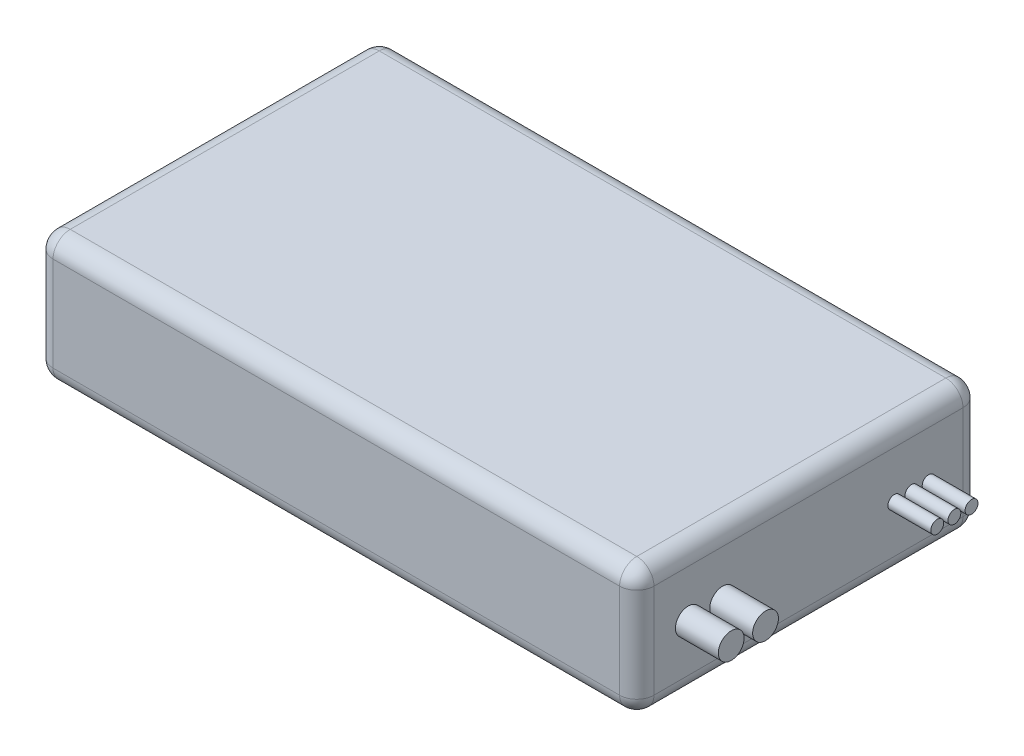
ISO-10303-21;
HEADER;
FILE_DESCRIPTION(('STEP AP214'),'2;1');
FILE_NAME('part.step','',(''),(''),'','','');
FILE_SCHEMA(('AUTOMOTIVE_DESIGN { 1 0 10303 214 1 1 1 1 }'));
ENDSEC;
DATA;
#1=APPLICATION_CONTEXT('core data for automotive mechanical design processes');
#2=APPLICATION_PROTOCOL_DEFINITION('international standard','automotive_design',2000,#1);
#3=PRODUCT_CONTEXT('',#1,'mechanical');
#4=PRODUCT('Part','Part','',(#3));
#5=PRODUCT_RELATED_PRODUCT_CATEGORY('part','',(#4));
#6=PRODUCT_DEFINITION_FORMATION('','',#4);
#7=PRODUCT_DEFINITION_CONTEXT('part definition',#1,'design');
#8=PRODUCT_DEFINITION('design','',#6,#7);
#9=PRODUCT_DEFINITION_SHAPE('','',#8);
#10=(LENGTH_UNIT() NAMED_UNIT(*) SI_UNIT(.MILLI.,.METRE.));
#11=(NAMED_UNIT(*) PLANE_ANGLE_UNIT() SI_UNIT($,.RADIAN.));
#12=(NAMED_UNIT(*) SI_UNIT($,.STERADIAN.) SOLID_ANGLE_UNIT());
#13=UNCERTAINTY_MEASURE_WITH_UNIT(LENGTH_MEASURE(1.E-05),#10,'distance_accuracy_value','');
#14=(GEOMETRIC_REPRESENTATION_CONTEXT(3) GLOBAL_UNCERTAINTY_ASSIGNED_CONTEXT((#13)) GLOBAL_UNIT_ASSIGNED_CONTEXT((#10,
#11,#12)) REPRESENTATION_CONTEXT('',''));
#15=CARTESIAN_POINT('',(0.,0.,0.));
#16=DIRECTION('',(0.,0.,1.));
#17=DIRECTION('',(1.,0.,0.));
#18=AXIS2_PLACEMENT_3D('',#15,#16,#17);
#19=CARTESIAN_POINT('',(70.,15.,0.));
#20=DIRECTION('',(-1.,0.,0.));
#21=DIRECTION('',(0.,0.,1.));
#22=AXIS2_PLACEMENT_3D('',#19,#20,#21);
#23=PLANE('',#22);
#24=CARTESIAN_POINT('',(70.,7.5,-32.));
#25=DIRECTION('',(-1.,0.,0.));
#26=DIRECTION('',(0.,0.,1.));
#27=AXIS2_PLACEMENT_3D('',#24,#25,#26);
#28=CIRCLE('',#27,0.749999999999999);
#29=CARTESIAN_POINT('',(70.,7.5,-31.25));
#30=VERTEX_POINT('',#29);
#31=EDGE_CURVE('E42',#30,#30,#28,.F.);
#32=ORIENTED_EDGE('',*,*,#31,.F.);
#33=EDGE_LOOP('',(#32));
#34=FACE_BOUND('',#33,.T.);
#35=CARTESIAN_POINT('',(70.,7.5,-10.));
#36=DIRECTION('',(-1.,0.,0.));
#37=DIRECTION('',(0.,0.,1.));
#38=AXIS2_PLACEMENT_3D('',#35,#36,#37);
#39=CIRCLE('',#38,1.5);
#40=CARTESIAN_POINT('',(70.,7.5,-8.5));
#41=VERTEX_POINT('',#40);
#42=EDGE_CURVE('E205',#41,#41,#39,.F.);
#43=ORIENTED_EDGE('',*,*,#42,.F.);
#44=EDGE_LOOP('',(#43));
#45=FACE_BOUND('',#44,.T.);
#46=DIRECTION('',(0.,-1.,0.));
#47=VECTOR('',#46,1.);
#48=CARTESIAN_POINT('',(70.,15.,-2.));
#49=LINE('',#48,#47);
#50=CARTESIAN_POINT('',(70.,13.,-2.));
#51=VERTEX_POINT('',#50);
#52=CARTESIAN_POINT('',(70.,2.,-2.));
#53=VERTEX_POINT('',#52);
#54=EDGE_CURVE('E224',#51,#53,#49,.T.);
#55=ORIENTED_EDGE('',*,*,#54,.T.);
#56=DIRECTION('',(0.,0.,-1.));
#57=VECTOR('',#56,1.);
#58=CARTESIAN_POINT('',(70.,2.,-40.));
#59=LINE('',#58,#57);
#60=CARTESIAN_POINT('',(70.,2.,-38.));
#61=VERTEX_POINT('',#60);
#62=EDGE_CURVE('E430',#53,#61,#59,.T.);
#63=ORIENTED_EDGE('',*,*,#62,.T.);
#64=DIRECTION('',(0.,-1.,0.));
#65=VECTOR('',#64,1.);
#66=CARTESIAN_POINT('',(70.,15.,-38.));
#67=LINE('',#66,#65);
#68=CARTESIAN_POINT('',(70.,13.,-38.));
#69=VERTEX_POINT('',#68);
#70=EDGE_CURVE('E427',#61,#69,#67,.F.);
#71=ORIENTED_EDGE('',*,*,#70,.T.);
#72=DIRECTION('',(0.,0.,-1.));
#73=VECTOR('',#72,1.);
#74=CARTESIAN_POINT('',(70.,13.,0.));
#75=LINE('',#74,#73);
#76=EDGE_CURVE('E369',#69,#51,#75,.F.);
#77=ORIENTED_EDGE('',*,*,#76,.T.);
#78=EDGE_LOOP('',(#55,#63,#71,#77));
#79=FACE_BOUND('',#78,.T.);
#80=CARTESIAN_POINT('',(70.,7.5,-6.));
#81=DIRECTION('',(-1.,0.,0.));
#82=DIRECTION('',(0.,0.,1.));
#83=AXIS2_PLACEMENT_3D('',#80,#81,#82);
#84=CIRCLE('',#83,1.5);
#85=CARTESIAN_POINT('',(70.,7.5,-4.5));
#86=VERTEX_POINT('',#85);
#87=EDGE_CURVE('E202',#86,#86,#84,.F.);
#88=ORIENTED_EDGE('',*,*,#87,.F.);
#89=EDGE_LOOP('',(#88));
#90=FACE_BOUND('',#89,.T.);
#91=CARTESIAN_POINT('',(70.,7.5,-30.));
#92=DIRECTION('',(-1.,0.,0.));
#93=DIRECTION('',(0.,0.,1.));
#94=AXIS2_PLACEMENT_3D('',#91,#92,#93);
#95=CIRCLE('',#94,0.750000000000002);
#96=CARTESIAN_POINT('',(70.,7.5,-29.25));
#97=VERTEX_POINT('',#96);
#98=EDGE_CURVE('E209',#97,#97,#95,.F.);
#99=ORIENTED_EDGE('',*,*,#98,.F.);
#100=EDGE_LOOP('',(#99));
#101=FACE_BOUND('',#100,.T.);
#102=CARTESIAN_POINT('',(70.,7.5,-34.));
#103=DIRECTION('',(-1.,0.,0.));
#104=DIRECTION('',(0.,0.,1.));
#105=AXIS2_PLACEMENT_3D('',#102,#103,#104);
#106=CIRCLE('',#105,0.749999999999999);
#107=CARTESIAN_POINT('',(70.,7.5,-33.25));
#108=VERTEX_POINT('',#107);
#109=EDGE_CURVE('E11',#108,#108,#106,.F.);
#110=ORIENTED_EDGE('',*,*,#109,.F.);
#111=EDGE_LOOP('',(#110));
#112=FACE_BOUND('',#111,.T.);
#113=ADVANCED_FACE('F34',(#34,#45,#79,#90,#101,#112),#23,.F.);
#114=CARTESIAN_POINT('',(0.,15.,0.));
#115=DIRECTION('',(1.,0.,0.));
#116=DIRECTION('',(0.,0.,-1.));
#117=AXIS2_PLACEMENT_3D('',#114,#115,#116);
#118=PLANE('',#117);
#119=DIRECTION('',(0.,-1.,0.));
#120=VECTOR('',#119,1.);
#121=CARTESIAN_POINT('',(0.,15.,-38.));
#122=LINE('',#121,#120);
#123=CARTESIAN_POINT('',(0.,13.,-38.));
#124=VERTEX_POINT('',#123);
#125=CARTESIAN_POINT('',(0.,2.,-38.));
#126=VERTEX_POINT('',#125);
#127=EDGE_CURVE('E133',#124,#126,#122,.T.);
#128=ORIENTED_EDGE('',*,*,#127,.T.);
#129=DIRECTION('',(0.,0.,1.));
#130=VECTOR('',#129,1.);
#131=CARTESIAN_POINT('',(0.,2.,0.));
#132=LINE('',#131,#130);
#133=CARTESIAN_POINT('',(0.,2.,-2.));
#134=VERTEX_POINT('',#133);
#135=EDGE_CURVE('E129',#126,#134,#132,.T.);
#136=ORIENTED_EDGE('',*,*,#135,.T.);
#137=DIRECTION('',(0.,-1.,0.));
#138=VECTOR('',#137,1.);
#139=CARTESIAN_POINT('',(0.,15.,-2.));
#140=LINE('',#139,#138);
#141=CARTESIAN_POINT('',(0.,13.,-2.));
#142=VERTEX_POINT('',#141);
#143=EDGE_CURVE('E123',#134,#142,#140,.F.);
#144=ORIENTED_EDGE('',*,*,#143,.T.);
#145=DIRECTION('',(0.,0.,1.));
#146=VECTOR('',#145,1.);
#147=CARTESIAN_POINT('',(0.,13.,0.));
#148=LINE('',#147,#146);
#149=EDGE_CURVE('E126',#142,#124,#148,.F.);
#150=ORIENTED_EDGE('',*,*,#149,.T.);
#151=EDGE_LOOP('',(#128,#136,#144,#150));
#152=FACE_BOUND('',#151,.T.);
#153=ADVANCED_FACE('F125',(#152),#118,.F.);
#154=CARTESIAN_POINT('',(0.,15.,0.));
#155=DIRECTION('',(0.,0.,-1.));
#156=DIRECTION('',(-1.,0.,0.));
#157=AXIS2_PLACEMENT_3D('',#154,#155,#156);
#158=PLANE('',#157);
#159=DIRECTION('',(0.,-1.,0.));
#160=VECTOR('',#159,1.);
#161=CARTESIAN_POINT('',(2.,15.,0.));
#162=LINE('',#161,#160);
#163=CARTESIAN_POINT('',(2.,13.,0.));
#164=VERTEX_POINT('',#163);
#165=CARTESIAN_POINT('',(2.,2.,0.));
#166=VERTEX_POINT('',#165);
#167=EDGE_CURVE('E156',#164,#166,#162,.T.);
#168=ORIENTED_EDGE('',*,*,#167,.T.);
#169=DIRECTION('',(1.,0.,0.));
#170=VECTOR('',#169,1.);
#171=CARTESIAN_POINT('',(70.,2.,0.));
#172=LINE('',#171,#170);
#173=CARTESIAN_POINT('',(68.,2.,0.));
#174=VERTEX_POINT('',#173);
#175=EDGE_CURVE('E424',#166,#174,#172,.T.);
#176=ORIENTED_EDGE('',*,*,#175,.T.);
#177=DIRECTION('',(0.,-1.,0.));
#178=VECTOR('',#177,1.);
#179=CARTESIAN_POINT('',(68.,15.,0.));
#180=LINE('',#179,#178);
#181=CARTESIAN_POINT('',(68.,13.,0.));
#182=VERTEX_POINT('',#181);
#183=EDGE_CURVE('E421',#174,#182,#180,.F.);
#184=ORIENTED_EDGE('',*,*,#183,.T.);
#185=DIRECTION('',(1.,0.,0.));
#186=VECTOR('',#185,1.);
#187=CARTESIAN_POINT('',(0.,13.,0.));
#188=LINE('',#187,#186);
#189=EDGE_CURVE('E419',#182,#164,#188,.F.);
#190=ORIENTED_EDGE('',*,*,#189,.T.);
#191=EDGE_LOOP('',(#168,#176,#184,#190));
#192=FACE_BOUND('',#191,.T.);
#193=ADVANCED_FACE('F284',(#192),#158,.F.);
#194=CARTESIAN_POINT('',(0.,15.,-40.));
#195=DIRECTION('',(0.,0.,1.));
#196=DIRECTION('',(1.,0.,0.));
#197=AXIS2_PLACEMENT_3D('',#194,#195,#196);
#198=PLANE('',#197);
#199=DIRECTION('',(0.,-1.,0.));
#200=VECTOR('',#199,1.);
#201=CARTESIAN_POINT('',(68.,15.,-40.));
#202=LINE('',#201,#200);
#203=CARTESIAN_POINT('',(68.,13.,-40.));
#204=VERTEX_POINT('',#203);
#205=CARTESIAN_POINT('',(68.,2.,-40.));
#206=VERTEX_POINT('',#205);
#207=EDGE_CURVE('E409',#204,#206,#202,.T.);
#208=ORIENTED_EDGE('',*,*,#207,.T.);
#209=DIRECTION('',(-1.,0.,0.));
#210=VECTOR('',#209,1.);
#211=CARTESIAN_POINT('',(0.,2.,-40.));
#212=LINE('',#211,#210);
#213=CARTESIAN_POINT('',(1.99999999999999,2.,-40.));
#214=VERTEX_POINT('',#213);
#215=EDGE_CURVE('E416',#206,#214,#212,.T.);
#216=ORIENTED_EDGE('',*,*,#215,.T.);
#217=DIRECTION('',(0.,-1.,0.));
#218=VECTOR('',#217,1.);
#219=CARTESIAN_POINT('',(1.99999999999999,15.,-40.));
#220=LINE('',#219,#218);
#221=CARTESIAN_POINT('',(1.99999999999999,13.,-40.));
#222=VERTEX_POINT('',#221);
#223=EDGE_CURVE('E414',#214,#222,#220,.F.);
#224=ORIENTED_EDGE('',*,*,#223,.T.);
#225=DIRECTION('',(-1.,0.,0.));
#226=VECTOR('',#225,1.);
#227=CARTESIAN_POINT('',(0.,13.,-40.));
#228=LINE('',#227,#226);
#229=EDGE_CURVE('E407',#222,#204,#228,.F.);
#230=ORIENTED_EDGE('',*,*,#229,.T.);
#231=EDGE_LOOP('',(#208,#216,#224,#230));
#232=FACE_BOUND('',#231,.T.);
#233=ADVANCED_FACE('F279',(#232),#198,.F.);
#234=CARTESIAN_POINT('',(0.,15.,-40.));
#235=DIRECTION('',(0.,-1.,0.));
#236=DIRECTION('',(0.,0.,-1.));
#237=AXIS2_PLACEMENT_3D('',#234,#235,#236);
#238=PLANE('',#237);
#239=DIRECTION('',(1.,0.,0.));
#240=VECTOR('',#239,1.);
#241=CARTESIAN_POINT('',(0.,15.,-2.));
#242=LINE('',#241,#240);
#243=CARTESIAN_POINT('',(2.,15.,-2.));
#244=VERTEX_POINT('',#243);
#245=CARTESIAN_POINT('',(68.,15.,-2.));
#246=VERTEX_POINT('',#245);
#247=EDGE_CURVE('E371',#244,#246,#242,.T.);
#248=ORIENTED_EDGE('',*,*,#247,.T.);
#249=DIRECTION('',(0.,0.,-1.));
#250=VECTOR('',#249,1.);
#251=CARTESIAN_POINT('',(68.,15.,-40.));
#252=LINE('',#251,#250);
#253=CARTESIAN_POINT('',(68.,15.,-38.));
#254=VERTEX_POINT('',#253);
#255=EDGE_CURVE('E206',#246,#254,#252,.T.);
#256=ORIENTED_EDGE('',*,*,#255,.T.);
#257=DIRECTION('',(-1.,0.,0.));
#258=VECTOR('',#257,1.);
#259=CARTESIAN_POINT('',(0.,15.,-38.));
#260=LINE('',#259,#258);
#261=CARTESIAN_POINT('',(1.99999999999999,15.,-38.));
#262=VERTEX_POINT('',#261);
#263=EDGE_CURVE('E49',#254,#262,#260,.T.);
#264=ORIENTED_EDGE('',*,*,#263,.T.);
#265=DIRECTION('',(0.,0.,1.));
#266=VECTOR('',#265,1.);
#267=CARTESIAN_POINT('',(1.99999999999999,15.,-40.));
#268=LINE('',#267,#266);
#269=EDGE_CURVE('E373',#262,#244,#268,.T.);
#270=ORIENTED_EDGE('',*,*,#269,.T.);
#271=EDGE_LOOP('',(#248,#256,#264,#270));
#272=FACE_BOUND('',#271,.T.);
#273=ADVANCED_FACE('F275',(#272),#238,.F.);
#274=CARTESIAN_POINT('',(0.,0.,-40.));
#275=DIRECTION('',(0.,-1.,0.));
#276=DIRECTION('',(0.,0.,-1.));
#277=AXIS2_PLACEMENT_3D('',#274,#275,#276);
#278=PLANE('',#277);
#279=DIRECTION('',(1.,0.,0.));
#280=VECTOR('',#279,1.);
#281=CARTESIAN_POINT('',(0.,0.,-2.));
#282=LINE('',#281,#280);
#283=CARTESIAN_POINT('',(68.,0.,-2.));
#284=VERTEX_POINT('',#283);
#285=CARTESIAN_POINT('',(2.,0.,-2.));
#286=VERTEX_POINT('',#285);
#287=EDGE_CURVE('E404',#284,#286,#282,.F.);
#288=ORIENTED_EDGE('',*,*,#287,.T.);
#289=DIRECTION('',(0.,0.,1.));
#290=VECTOR('',#289,1.);
#291=CARTESIAN_POINT('',(1.99999999999999,0.,-40.));
#292=LINE('',#291,#290);
#293=CARTESIAN_POINT('',(1.99999999999999,0.,-38.));
#294=VERTEX_POINT('',#293);
#295=EDGE_CURVE('E399',#286,#294,#292,.F.);
#296=ORIENTED_EDGE('',*,*,#295,.T.);
#297=DIRECTION('',(-1.,0.,0.));
#298=VECTOR('',#297,1.);
#299=CARTESIAN_POINT('',(70.,0.,-38.));
#300=LINE('',#299,#298);
#301=CARTESIAN_POINT('',(68.,0.,-38.));
#302=VERTEX_POINT('',#301);
#303=EDGE_CURVE('E395',#294,#302,#300,.F.);
#304=ORIENTED_EDGE('',*,*,#303,.T.);
#305=DIRECTION('',(0.,0.,-1.));
#306=VECTOR('',#305,1.);
#307=CARTESIAN_POINT('',(68.,0.,0.));
#308=LINE('',#307,#306);
#309=EDGE_CURVE('E400',#302,#284,#308,.F.);
#310=ORIENTED_EDGE('',*,*,#309,.T.);
#311=EDGE_LOOP('',(#288,#296,#304,#310));
#312=FACE_BOUND('',#311,.T.);
#313=ADVANCED_FACE('F278',(#312),#278,.T.);
#314=CARTESIAN_POINT('',(68.,13.,-40.));
#315=DIRECTION('',(0.,0.,-1.));
#316=DIRECTION('',(-1.,0.,0.));
#317=AXIS2_PLACEMENT_3D('',#314,#315,#316);
#318=CYLINDRICAL_SURFACE('',#317,2.);
#319=CARTESIAN_POINT('',(68.,13.,-38.));
#320=DIRECTION('',(0.,0.,-1.));
#321=DIRECTION('',(-1.,0.,0.));
#322=AXIS2_PLACEMENT_3D('',#319,#320,#321);
#323=CIRCLE('',#322,2.);
#324=EDGE_CURVE('E144',#254,#69,#323,.T.);
#325=ORIENTED_EDGE('',*,*,#324,.F.);
#326=ORIENTED_EDGE('',*,*,#255,.F.);
#327=CARTESIAN_POINT('',(68.,13.,-2.));
#328=DIRECTION('',(0.,0.,1.));
#329=DIRECTION('',(0.,-1.,0.));
#330=AXIS2_PLACEMENT_3D('',#327,#328,#329);
#331=CIRCLE('',#330,2.);
#332=EDGE_CURVE('E197',#51,#246,#331,.T.);
#333=ORIENTED_EDGE('',*,*,#332,.F.);
#334=ORIENTED_EDGE('',*,*,#76,.F.);
#335=EDGE_LOOP('',(#325,#326,#333,#334));
#336=FACE_BOUND('',#335,.T.);
#337=ADVANCED_FACE('F36',(#336),#318,.T.);
#338=CARTESIAN_POINT('',(68.,13.,-38.));
#339=DIRECTION('',(0.,0.,1.));
#340=DIRECTION('',(1.,0.,0.));
#341=AXIS2_PLACEMENT_3D('',#338,#339,#340);
#342=SPHERICAL_SURFACE('',#341,2.);
#343=CARTESIAN_POINT('',(68.,13.,-38.));
#344=DIRECTION('',(1.,0.,0.));
#345=DIRECTION('',(0.,0.,-1.));
#346=AXIS2_PLACEMENT_3D('',#343,#344,#345);
#347=CIRCLE('',#346,2.);
#348=EDGE_CURVE('E192',#254,#204,#347,.F.);
#349=ORIENTED_EDGE('',*,*,#348,.F.);
#350=ORIENTED_EDGE('',*,*,#324,.T.);
#351=CARTESIAN_POINT('',(68.,13.,-38.));
#352=DIRECTION('',(0.,1.,0.));
#353=DIRECTION('',(0.,0.,1.));
#354=AXIS2_PLACEMENT_3D('',#351,#352,#353);
#355=CIRCLE('',#354,2.);
#356=EDGE_CURVE('E194',#204,#69,#355,.F.);
#357=ORIENTED_EDGE('',*,*,#356,.F.);
#358=EDGE_LOOP('',(#349,#350,#357));
#359=FACE_BOUND('',#358,.T.);
#360=ADVANCED_FACE('F354',(#359),#342,.T.);
#361=CARTESIAN_POINT('',(68.,13.,-2.));
#362=DIRECTION('',(0.,0.,1.));
#363=DIRECTION('',(1.,0.,0.));
#364=AXIS2_PLACEMENT_3D('',#361,#362,#363);
#365=SPHERICAL_SURFACE('',#364,2.);
#366=CARTESIAN_POINT('',(68.,13.,-2.));
#367=DIRECTION('',(0.,1.,0.));
#368=DIRECTION('',(0.,0.,1.));
#369=AXIS2_PLACEMENT_3D('',#366,#367,#368);
#370=CIRCLE('',#369,2.);
#371=EDGE_CURVE('E186',#51,#182,#370,.F.);
#372=ORIENTED_EDGE('',*,*,#371,.F.);
#373=ORIENTED_EDGE('',*,*,#332,.T.);
#374=CARTESIAN_POINT('',(68.,13.,-2.));
#375=DIRECTION('',(1.,0.,0.));
#376=DIRECTION('',(0.,0.,-1.));
#377=AXIS2_PLACEMENT_3D('',#374,#375,#376);
#378=CIRCLE('',#377,2.);
#379=EDGE_CURVE('E189',#182,#246,#378,.F.);
#380=ORIENTED_EDGE('',*,*,#379,.F.);
#381=EDGE_LOOP('',(#372,#373,#380));
#382=FACE_BOUND('',#381,.T.);
#383=ADVANCED_FACE('F351',(#382),#365,.T.);
#384=CARTESIAN_POINT('',(68.,15.,-38.));
#385=DIRECTION('',(0.,-1.,0.));
#386=DIRECTION('',(0.,0.,-1.));
#387=AXIS2_PLACEMENT_3D('',#384,#385,#386);
#388=CYLINDRICAL_SURFACE('',#387,2.);
#389=ORIENTED_EDGE('',*,*,#356,.T.);
#390=ORIENTED_EDGE('',*,*,#70,.F.);
#391=CARTESIAN_POINT('',(68.,2.,-38.));
#392=DIRECTION('',(0.,-1.,0.));
#393=DIRECTION('',(0.,0.,-1.));
#394=AXIS2_PLACEMENT_3D('',#391,#392,#393);
#395=CIRCLE('',#394,2.);
#396=EDGE_CURVE('E180',#206,#61,#395,.T.);
#397=ORIENTED_EDGE('',*,*,#396,.F.);
#398=ORIENTED_EDGE('',*,*,#207,.F.);
#399=EDGE_LOOP('',(#389,#390,#397,#398));
#400=FACE_BOUND('',#399,.T.);
#401=ADVANCED_FACE('F348',(#400),#388,.T.);
#402=CARTESIAN_POINT('',(0.,13.,-38.));
#403=DIRECTION('',(-1.,0.,0.));
#404=DIRECTION('',(0.,0.,1.));
#405=AXIS2_PLACEMENT_3D('',#402,#403,#404);
#406=CYLINDRICAL_SURFACE('',#405,2.);
#407=ORIENTED_EDGE('',*,*,#348,.T.);
#408=ORIENTED_EDGE('',*,*,#229,.F.);
#409=CARTESIAN_POINT('',(1.99999999999999,13.,-38.));
#410=DIRECTION('',(-1.,0.,0.));
#411=DIRECTION('',(0.,0.,1.));
#412=AXIS2_PLACEMENT_3D('',#409,#410,#411);
#413=CIRCLE('',#412,2.);
#414=EDGE_CURVE('E177',#262,#222,#413,.T.);
#415=ORIENTED_EDGE('',*,*,#414,.F.);
#416=ORIENTED_EDGE('',*,*,#263,.F.);
#417=EDGE_LOOP('',(#407,#408,#415,#416));
#418=FACE_BOUND('',#417,.T.);
#419=ADVANCED_FACE('F345',(#418),#406,.T.);
#420=CARTESIAN_POINT('',(1.99999999999999,13.,-40.));
#421=DIRECTION('',(0.,0.,1.));
#422=DIRECTION('',(1.,0.,0.));
#423=AXIS2_PLACEMENT_3D('',#420,#421,#422);
#424=CYLINDRICAL_SURFACE('',#423,2.);
#425=CARTESIAN_POINT('',(2.,13.,-2.));
#426=DIRECTION('',(0.,0.,1.));
#427=DIRECTION('',(1.,0.,0.));
#428=AXIS2_PLACEMENT_3D('',#425,#426,#427);
#429=CIRCLE('',#428,2.);
#430=EDGE_CURVE('E139',#244,#142,#429,.T.);
#431=ORIENTED_EDGE('',*,*,#430,.F.);
#432=ORIENTED_EDGE('',*,*,#269,.F.);
#433=CARTESIAN_POINT('',(1.99999999999999,13.,-38.));
#434=DIRECTION('',(0.,0.,-1.));
#435=DIRECTION('',(-1.,0.,0.));
#436=AXIS2_PLACEMENT_3D('',#433,#434,#435);
#437=CIRCLE('',#436,2.);
#438=EDGE_CURVE('E142',#124,#262,#437,.T.);
#439=ORIENTED_EDGE('',*,*,#438,.F.);
#440=ORIENTED_EDGE('',*,*,#149,.F.);
#441=EDGE_LOOP('',(#431,#432,#439,#440));
#442=FACE_BOUND('',#441,.T.);
#443=ADVANCED_FACE('F138',(#442),#424,.T.);
#444=CARTESIAN_POINT('',(0.,13.,-2.));
#445=DIRECTION('',(1.,0.,0.));
#446=DIRECTION('',(0.,0.,-1.));
#447=AXIS2_PLACEMENT_3D('',#444,#445,#446);
#448=CYLINDRICAL_SURFACE('',#447,2.);
#449=ORIENTED_EDGE('',*,*,#379,.T.);
#450=ORIENTED_EDGE('',*,*,#247,.F.);
#451=CARTESIAN_POINT('',(2.,13.,-2.));
#452=DIRECTION('',(-1.,0.,0.));
#453=DIRECTION('',(0.,0.,1.));
#454=AXIS2_PLACEMENT_3D('',#451,#452,#453);
#455=CIRCLE('',#454,2.);
#456=EDGE_CURVE('E152',#164,#244,#455,.T.);
#457=ORIENTED_EDGE('',*,*,#456,.F.);
#458=ORIENTED_EDGE('',*,*,#189,.F.);
#459=EDGE_LOOP('',(#449,#450,#457,#458));
#460=FACE_BOUND('',#459,.T.);
#461=ADVANCED_FACE('F338',(#460),#448,.T.);
#462=CARTESIAN_POINT('',(68.,15.,-2.));
#463=DIRECTION('',(0.,-1.,0.));
#464=DIRECTION('',(0.,0.,-1.));
#465=AXIS2_PLACEMENT_3D('',#462,#463,#464);
#466=CYLINDRICAL_SURFACE('',#465,2.);
#467=ORIENTED_EDGE('',*,*,#371,.T.);
#468=ORIENTED_EDGE('',*,*,#183,.F.);
#469=CARTESIAN_POINT('',(68.,2.,-2.));
#470=DIRECTION('',(0.,-1.,0.));
#471=DIRECTION('',(0.,0.,-1.));
#472=AXIS2_PLACEMENT_3D('',#469,#470,#471);
#473=CIRCLE('',#472,2.);
#474=EDGE_CURVE('E172',#53,#174,#473,.T.);
#475=ORIENTED_EDGE('',*,*,#474,.F.);
#476=ORIENTED_EDGE('',*,*,#54,.F.);
#477=EDGE_LOOP('',(#467,#468,#475,#476));
#478=FACE_BOUND('',#477,.T.);
#479=ADVANCED_FACE('F334',(#478),#466,.T.);
#480=CARTESIAN_POINT('',(68.,2.,0.));
#481=DIRECTION('',(0.,0.,1.));
#482=DIRECTION('',(1.,0.,0.));
#483=AXIS2_PLACEMENT_3D('',#480,#481,#482);
#484=CYLINDRICAL_SURFACE('',#483,2.);
#485=CARTESIAN_POINT('',(68.,2.,-38.));
#486=DIRECTION('',(0.,0.,-1.));
#487=DIRECTION('',(-1.,0.,0.));
#488=AXIS2_PLACEMENT_3D('',#485,#486,#487);
#489=CIRCLE('',#488,2.);
#490=EDGE_CURVE('E183',#61,#302,#489,.T.);
#491=ORIENTED_EDGE('',*,*,#490,.F.);
#492=ORIENTED_EDGE('',*,*,#62,.F.);
#493=CARTESIAN_POINT('',(68.,2.,-2.));
#494=DIRECTION('',(0.,0.,1.));
#495=DIRECTION('',(1.,0.,0.));
#496=AXIS2_PLACEMENT_3D('',#493,#494,#495);
#497=CIRCLE('',#496,2.);
#498=EDGE_CURVE('E170',#284,#53,#497,.T.);
#499=ORIENTED_EDGE('',*,*,#498,.F.);
#500=ORIENTED_EDGE('',*,*,#309,.F.);
#501=EDGE_LOOP('',(#491,#492,#499,#500));
#502=FACE_BOUND('',#501,.T.);
#503=ADVANCED_FACE('F330',(#502),#484,.T.);
#504=CARTESIAN_POINT('',(68.,2.,-38.));
#505=DIRECTION('',(0.,0.,1.));
#506=DIRECTION('',(1.,0.,0.));
#507=AXIS2_PLACEMENT_3D('',#504,#505,#506);
#508=SPHERICAL_SURFACE('',#507,2.);
#509=ORIENTED_EDGE('',*,*,#396,.T.);
#510=ORIENTED_EDGE('',*,*,#490,.T.);
#511=CARTESIAN_POINT('',(68.,2.,-38.));
#512=DIRECTION('',(1.,0.,0.));
#513=DIRECTION('',(0.,0.,-1.));
#514=AXIS2_PLACEMENT_3D('',#511,#512,#513);
#515=CIRCLE('',#514,2.);
#516=EDGE_CURVE('E161',#206,#302,#515,.F.);
#517=ORIENTED_EDGE('',*,*,#516,.F.);
#518=EDGE_LOOP('',(#509,#510,#517));
#519=FACE_BOUND('',#518,.T.);
#520=ADVANCED_FACE('F326',(#519),#508,.T.);
#521=CARTESIAN_POINT('',(1.99999999999999,13.,-38.));
#522=DIRECTION('',(0.,0.,1.));
#523=DIRECTION('',(1.,0.,0.));
#524=AXIS2_PLACEMENT_3D('',#521,#522,#523);
#525=SPHERICAL_SURFACE('',#524,2.);
#526=ORIENTED_EDGE('',*,*,#438,.T.);
#527=ORIENTED_EDGE('',*,*,#414,.T.);
#528=CARTESIAN_POINT('',(1.99999999999999,13.,-38.));
#529=DIRECTION('',(0.,1.,0.));
#530=DIRECTION('',(0.,0.,1.));
#531=AXIS2_PLACEMENT_3D('',#528,#529,#530);
#532=CIRCLE('',#531,2.);
#533=EDGE_CURVE('E157',#124,#222,#532,.F.);
#534=ORIENTED_EDGE('',*,*,#533,.F.);
#535=EDGE_LOOP('',(#526,#527,#534));
#536=FACE_BOUND('',#535,.T.);
#537=ADVANCED_FACE('F323',(#536),#525,.T.);
#538=CARTESIAN_POINT('',(2.,13.,-2.));
#539=DIRECTION('',(0.,0.,1.));
#540=DIRECTION('',(1.,0.,0.));
#541=AXIS2_PLACEMENT_3D('',#538,#539,#540);
#542=SPHERICAL_SURFACE('',#541,2.);
#543=ORIENTED_EDGE('',*,*,#456,.T.);
#544=ORIENTED_EDGE('',*,*,#430,.T.);
#545=CARTESIAN_POINT('',(2.,13.,-2.));
#546=DIRECTION('',(0.,1.,0.));
#547=DIRECTION('',(0.,0.,1.));
#548=AXIS2_PLACEMENT_3D('',#545,#546,#547);
#549=CIRCLE('',#548,2.);
#550=EDGE_CURVE('E149',#164,#142,#549,.F.);
#551=ORIENTED_EDGE('',*,*,#550,.F.);
#552=EDGE_LOOP('',(#543,#544,#551));
#553=FACE_BOUND('',#552,.T.);
#554=ADVANCED_FACE('F148',(#553),#542,.T.);
#555=CARTESIAN_POINT('',(68.,2.,-2.));
#556=DIRECTION('',(0.,0.,1.));
#557=DIRECTION('',(1.,0.,0.));
#558=AXIS2_PLACEMENT_3D('',#555,#556,#557);
#559=SPHERICAL_SURFACE('',#558,2.);
#560=ORIENTED_EDGE('',*,*,#498,.T.);
#561=ORIENTED_EDGE('',*,*,#474,.T.);
#562=CARTESIAN_POINT('',(68.,2.,-2.));
#563=DIRECTION('',(1.,0.,0.));
#564=DIRECTION('',(0.,0.,-1.));
#565=AXIS2_PLACEMENT_3D('',#562,#563,#564);
#566=CIRCLE('',#565,2.);
#567=EDGE_CURVE('E158',#284,#174,#566,.F.);
#568=ORIENTED_EDGE('',*,*,#567,.F.);
#569=EDGE_LOOP('',(#560,#561,#568));
#570=FACE_BOUND('',#569,.T.);
#571=ADVANCED_FACE('F316',(#570),#559,.T.);
#572=CARTESIAN_POINT('',(0.,2.,-38.));
#573=DIRECTION('',(1.,0.,0.));
#574=DIRECTION('',(0.,0.,-1.));
#575=AXIS2_PLACEMENT_3D('',#572,#573,#574);
#576=CYLINDRICAL_SURFACE('',#575,2.);
#577=ORIENTED_EDGE('',*,*,#516,.T.);
#578=ORIENTED_EDGE('',*,*,#303,.F.);
#579=CARTESIAN_POINT('',(1.99999999999999,2.,-38.));
#580=DIRECTION('',(-1.,0.,0.));
#581=DIRECTION('',(0.,0.,1.));
#582=AXIS2_PLACEMENT_3D('',#579,#580,#581);
#583=CIRCLE('',#582,2.);
#584=EDGE_CURVE('E164',#214,#294,#583,.T.);
#585=ORIENTED_EDGE('',*,*,#584,.F.);
#586=ORIENTED_EDGE('',*,*,#215,.F.);
#587=EDGE_LOOP('',(#577,#578,#585,#586));
#588=FACE_BOUND('',#587,.T.);
#589=ADVANCED_FACE('F312',(#588),#576,.T.);
#590=CARTESIAN_POINT('',(1.99999999999999,15.,-38.));
#591=DIRECTION('',(0.,-1.,0.));
#592=DIRECTION('',(0.,0.,-1.));
#593=AXIS2_PLACEMENT_3D('',#590,#591,#592);
#594=CYLINDRICAL_SURFACE('',#593,2.);
#595=ORIENTED_EDGE('',*,*,#533,.T.);
#596=ORIENTED_EDGE('',*,*,#223,.F.);
#597=CARTESIAN_POINT('',(1.99999999999999,2.,-38.));
#598=DIRECTION('',(0.,-1.,0.));
#599=DIRECTION('',(0.,0.,-1.));
#600=AXIS2_PLACEMENT_3D('',#597,#598,#599);
#601=CIRCLE('',#600,2.);
#602=EDGE_CURVE('E387',#126,#214,#601,.T.);
#603=ORIENTED_EDGE('',*,*,#602,.F.);
#604=ORIENTED_EDGE('',*,*,#127,.F.);
#605=EDGE_LOOP('',(#595,#596,#603,#604));
#606=FACE_BOUND('',#605,.T.);
#607=ADVANCED_FACE('F309',(#606),#594,.T.);
#608=CARTESIAN_POINT('',(2.,15.,-2.));
#609=DIRECTION('',(0.,-1.,0.));
#610=DIRECTION('',(0.,0.,-1.));
#611=AXIS2_PLACEMENT_3D('',#608,#609,#610);
#612=CYLINDRICAL_SURFACE('',#611,2.);
#613=ORIENTED_EDGE('',*,*,#550,.T.);
#614=ORIENTED_EDGE('',*,*,#143,.F.);
#615=CARTESIAN_POINT('',(2.,2.,-2.));
#616=DIRECTION('',(0.,-1.,0.));
#617=DIRECTION('',(0.,0.,-1.));
#618=AXIS2_PLACEMENT_3D('',#615,#616,#617);
#619=CIRCLE('',#618,2.);
#620=EDGE_CURVE('E384',#166,#134,#619,.T.);
#621=ORIENTED_EDGE('',*,*,#620,.F.);
#622=ORIENTED_EDGE('',*,*,#167,.F.);
#623=EDGE_LOOP('',(#613,#614,#621,#622));
#624=FACE_BOUND('',#623,.T.);
#625=ADVANCED_FACE('F154',(#624),#612,.T.);
#626=CARTESIAN_POINT('',(0.,2.,-2.));
#627=DIRECTION('',(-1.,0.,0.));
#628=DIRECTION('',(0.,0.,1.));
#629=AXIS2_PLACEMENT_3D('',#626,#627,#628);
#630=CYLINDRICAL_SURFACE('',#629,2.);
#631=ORIENTED_EDGE('',*,*,#567,.T.);
#632=ORIENTED_EDGE('',*,*,#175,.F.);
#633=CARTESIAN_POINT('',(2.,2.,-2.));
#634=DIRECTION('',(-1.,0.,0.));
#635=DIRECTION('',(0.,0.,1.));
#636=AXIS2_PLACEMENT_3D('',#633,#634,#635);
#637=CIRCLE('',#636,2.);
#638=EDGE_CURVE('E382',#286,#166,#637,.T.);
#639=ORIENTED_EDGE('',*,*,#638,.F.);
#640=ORIENTED_EDGE('',*,*,#287,.F.);
#641=EDGE_LOOP('',(#631,#632,#639,#640));
#642=FACE_BOUND('',#641,.T.);
#643=ADVANCED_FACE('F302',(#642),#630,.T.);
#644=CARTESIAN_POINT('',(1.99999999999999,2.,-38.));
#645=DIRECTION('',(0.,0.,1.));
#646=DIRECTION('',(1.,0.,0.));
#647=AXIS2_PLACEMENT_3D('',#644,#645,#646);
#648=SPHERICAL_SURFACE('',#647,2.);
#649=ORIENTED_EDGE('',*,*,#602,.T.);
#650=ORIENTED_EDGE('',*,*,#584,.T.);
#651=CARTESIAN_POINT('',(1.99999999999999,2.,-38.));
#652=DIRECTION('',(0.,0.,-1.));
#653=DIRECTION('',(-1.,0.,0.));
#654=AXIS2_PLACEMENT_3D('',#651,#652,#653);
#655=CIRCLE('',#654,2.);
#656=EDGE_CURVE('E379',#126,#294,#655,.F.);
#657=ORIENTED_EDGE('',*,*,#656,.F.);
#658=EDGE_LOOP('',(#649,#650,#657));
#659=FACE_BOUND('',#658,.T.);
#660=ADVANCED_FACE('F298',(#659),#648,.T.);
#661=CARTESIAN_POINT('',(2.,2.,-2.));
#662=DIRECTION('',(0.,0.,1.));
#663=DIRECTION('',(1.,0.,0.));
#664=AXIS2_PLACEMENT_3D('',#661,#662,#663);
#665=SPHERICAL_SURFACE('',#664,2.);
#666=ORIENTED_EDGE('',*,*,#638,.T.);
#667=ORIENTED_EDGE('',*,*,#620,.T.);
#668=CARTESIAN_POINT('',(2.,2.,-2.));
#669=DIRECTION('',(0.,0.,1.));
#670=DIRECTION('',(1.,0.,0.));
#671=AXIS2_PLACEMENT_3D('',#668,#669,#670);
#672=CIRCLE('',#671,2.);
#673=EDGE_CURVE('E377',#286,#134,#672,.F.);
#674=ORIENTED_EDGE('',*,*,#673,.F.);
#675=EDGE_LOOP('',(#666,#667,#674));
#676=FACE_BOUND('',#675,.T.);
#677=ADVANCED_FACE('F294',(#676),#665,.T.);
#678=CARTESIAN_POINT('',(2.,2.,0.));
#679=DIRECTION('',(0.,0.,-1.));
#680=DIRECTION('',(-1.,0.,0.));
#681=AXIS2_PLACEMENT_3D('',#678,#679,#680);
#682=CYLINDRICAL_SURFACE('',#681,2.);
#683=ORIENTED_EDGE('',*,*,#656,.T.);
#684=ORIENTED_EDGE('',*,*,#295,.F.);
#685=ORIENTED_EDGE('',*,*,#673,.T.);
#686=ORIENTED_EDGE('',*,*,#135,.F.);
#687=EDGE_LOOP('',(#683,#684,#685,#686));
#688=FACE_BOUND('',#687,.T.);
#689=ADVANCED_FACE('F273',(#688),#682,.T.);
#690=CARTESIAN_POINT('',(75.,7.5,-6.));
#691=DIRECTION('',(-1.,0.,0.));
#692=DIRECTION('',(0.,0.,1.));
#693=AXIS2_PLACEMENT_3D('',#690,#691,#692);
#694=CYLINDRICAL_SURFACE('',#693,1.5);
#695=CARTESIAN_POINT('',(75.,7.5,-6.));
#696=DIRECTION('',(1.,0.,0.));
#697=DIRECTION('',(0.,0.,-1.));
#698=AXIS2_PLACEMENT_3D('',#695,#696,#697);
#699=CIRCLE('',#698,1.5);
#700=CARTESIAN_POINT('',(75.,7.5,-7.5));
#701=VERTEX_POINT('',#700);
#702=EDGE_CURVE('E380',#701,#701,#699,.T.);
#703=ORIENTED_EDGE('',*,*,#702,.F.);
#704=EDGE_LOOP('',(#703));
#705=FACE_BOUND('',#704,.T.);
#706=ORIENTED_EDGE('',*,*,#87,.T.);
#707=EDGE_LOOP('',(#706));
#708=FACE_BOUND('',#707,.T.);
#709=ADVANCED_FACE('F269',(#705,#708),#694,.T.);
#710=CARTESIAN_POINT('',(75.,7.5,-6.));
#711=DIRECTION('',(1.,0.,0.));
#712=DIRECTION('',(0.,0.,-1.));
#713=AXIS2_PLACEMENT_3D('',#710,#711,#712);
#714=PLANE('',#713);
#715=ORIENTED_EDGE('',*,*,#702,.T.);
#716=EDGE_LOOP('',(#715));
#717=FACE_BOUND('',#716,.T.);
#718=ADVANCED_FACE('F265',(#717),#714,.T.);
#719=CARTESIAN_POINT('',(75.,7.5,-10.));
#720=DIRECTION('',(-1.,0.,0.));
#721=DIRECTION('',(0.,0.,1.));
#722=AXIS2_PLACEMENT_3D('',#719,#720,#721);
#723=CYLINDRICAL_SURFACE('',#722,1.5);
#724=CARTESIAN_POINT('',(75.,7.5,-10.));
#725=DIRECTION('',(1.,0.,0.));
#726=DIRECTION('',(0.,0.,-1.));
#727=AXIS2_PLACEMENT_3D('',#724,#725,#726);
#728=CIRCLE('',#727,1.5);
#729=CARTESIAN_POINT('',(75.,7.5,-11.5));
#730=VERTEX_POINT('',#729);
#731=EDGE_CURVE('E450',#730,#730,#728,.T.);
#732=ORIENTED_EDGE('',*,*,#731,.F.);
#733=EDGE_LOOP('',(#732));
#734=FACE_BOUND('',#733,.T.);
#735=ORIENTED_EDGE('',*,*,#42,.T.);
#736=EDGE_LOOP('',(#735));
#737=FACE_BOUND('',#736,.T.);
#738=ADVANCED_FACE('F261',(#734,#737),#723,.T.);
#739=CARTESIAN_POINT('',(75.,7.5,-10.));
#740=DIRECTION('',(1.,0.,0.));
#741=DIRECTION('',(0.,0.,-1.));
#742=AXIS2_PLACEMENT_3D('',#739,#740,#741);
#743=PLANE('',#742);
#744=ORIENTED_EDGE('',*,*,#731,.T.);
#745=EDGE_LOOP('',(#744));
#746=FACE_BOUND('',#745,.T.);
#747=ADVANCED_FACE('F257',(#746),#743,.T.);
#748=CARTESIAN_POINT('',(75.,7.5,-30.));
#749=DIRECTION('',(-1.,0.,0.));
#750=DIRECTION('',(0.,0.,1.));
#751=AXIS2_PLACEMENT_3D('',#748,#749,#750);
#752=CYLINDRICAL_SURFACE('',#751,0.750000000000002);
#753=CARTESIAN_POINT('',(75.,7.5,-30.));
#754=DIRECTION('',(1.,0.,0.));
#755=DIRECTION('',(0.,0.,-1.));
#756=AXIS2_PLACEMENT_3D('',#753,#754,#755);
#757=CIRCLE('',#756,0.750000000000002);
#758=CARTESIAN_POINT('',(75.,7.5,-30.75));
#759=VERTEX_POINT('',#758);
#760=EDGE_CURVE('E453',#759,#759,#757,.T.);
#761=ORIENTED_EDGE('',*,*,#760,.F.);
#762=EDGE_LOOP('',(#761));
#763=FACE_BOUND('',#762,.T.);
#764=ORIENTED_EDGE('',*,*,#98,.T.);
#765=EDGE_LOOP('',(#764));
#766=FACE_BOUND('',#765,.T.);
#767=ADVANCED_FACE('F253',(#763,#766),#752,.T.);
#768=CARTESIAN_POINT('',(75.,7.5,-30.));
#769=DIRECTION('',(1.,0.,0.));
#770=DIRECTION('',(0.,0.,-1.));
#771=AXIS2_PLACEMENT_3D('',#768,#769,#770);
#772=PLANE('',#771);
#773=ORIENTED_EDGE('',*,*,#760,.T.);
#774=EDGE_LOOP('',(#773));
#775=FACE_BOUND('',#774,.T.);
#776=ADVANCED_FACE('F249',(#775),#772,.T.);
#777=CARTESIAN_POINT('',(75.,7.5,-32.));
#778=DIRECTION('',(-1.,0.,0.));
#779=DIRECTION('',(0.,0.,1.));
#780=AXIS2_PLACEMENT_3D('',#777,#778,#779);
#781=CYLINDRICAL_SURFACE('',#780,0.749999999999999);
#782=CARTESIAN_POINT('',(75.,7.5,-32.));
#783=DIRECTION('',(1.,0.,0.));
#784=DIRECTION('',(0.,0.,-1.));
#785=AXIS2_PLACEMENT_3D('',#782,#783,#784);
#786=CIRCLE('',#785,0.749999999999999);
#787=CARTESIAN_POINT('',(75.,7.5,-32.75));
#788=VERTEX_POINT('',#787);
#789=EDGE_CURVE('E456',#788,#788,#786,.T.);
#790=ORIENTED_EDGE('',*,*,#789,.F.);
#791=EDGE_LOOP('',(#790));
#792=FACE_BOUND('',#791,.T.);
#793=ORIENTED_EDGE('',*,*,#31,.T.);
#794=EDGE_LOOP('',(#793));
#795=FACE_BOUND('',#794,.T.);
#796=ADVANCED_FACE('F214',(#792,#795),#781,.T.);
#797=CARTESIAN_POINT('',(75.,7.5,-32.));
#798=DIRECTION('',(1.,0.,0.));
#799=DIRECTION('',(0.,0.,-1.));
#800=AXIS2_PLACEMENT_3D('',#797,#798,#799);
#801=PLANE('',#800);
#802=ORIENTED_EDGE('',*,*,#789,.T.);
#803=EDGE_LOOP('',(#802));
#804=FACE_BOUND('',#803,.T.);
#805=ADVANCED_FACE('F234',(#804),#801,.T.);
#806=CARTESIAN_POINT('',(75.,7.5,-34.));
#807=DIRECTION('',(-1.,0.,0.));
#808=DIRECTION('',(0.,0.,1.));
#809=AXIS2_PLACEMENT_3D('',#806,#807,#808);
#810=CYLINDRICAL_SURFACE('',#809,0.749999999999999);
#811=CARTESIAN_POINT('',(75.,7.5,-34.));
#812=DIRECTION('',(1.,0.,0.));
#813=DIRECTION('',(0.,0.,-1.));
#814=AXIS2_PLACEMENT_3D('',#811,#812,#813);
#815=CIRCLE('',#814,0.749999999999999);
#816=CARTESIAN_POINT('',(75.,7.5,-34.75));
#817=VERTEX_POINT('',#816);
#818=EDGE_CURVE('E459',#817,#817,#815,.T.);
#819=ORIENTED_EDGE('',*,*,#818,.F.);
#820=EDGE_LOOP('',(#819));
#821=FACE_BOUND('',#820,.T.);
#822=ORIENTED_EDGE('',*,*,#109,.T.);
#823=EDGE_LOOP('',(#822));
#824=FACE_BOUND('',#823,.T.);
#825=ADVANCED_FACE('F231',(#821,#824),#810,.T.);
#826=CARTESIAN_POINT('',(75.,7.5,-34.));
#827=DIRECTION('',(1.,0.,0.));
#828=DIRECTION('',(0.,0.,-1.));
#829=AXIS2_PLACEMENT_3D('',#826,#827,#828);
#830=PLANE('',#829);
#831=ORIENTED_EDGE('',*,*,#818,.T.);
#832=EDGE_LOOP('',(#831));
#833=FACE_BOUND('',#832,.T.);
#834=ADVANCED_FACE('F233',(#833),#830,.T.);
#835=CLOSED_SHELL('',(#113,#153,#193,#233,#273,#313,#337,#360,#383,#401,#419,#443,#461,#479,
#503,#520,#537,#554,#571,#589,#607,#625,#643,#660,#677,#689,#709,#718,#738,#747,#767,#776,#796,
#805,#825,#834));
#836=MANIFOLD_SOLID_BREP('B2',#835);
#837=ADVANCED_BREP_SHAPE_REPRESENTATION('',(#18,#836),#14);
#838=SHAPE_DEFINITION_REPRESENTATION(#9,#837);
ENDSEC;
END-ISO-10303-21;
